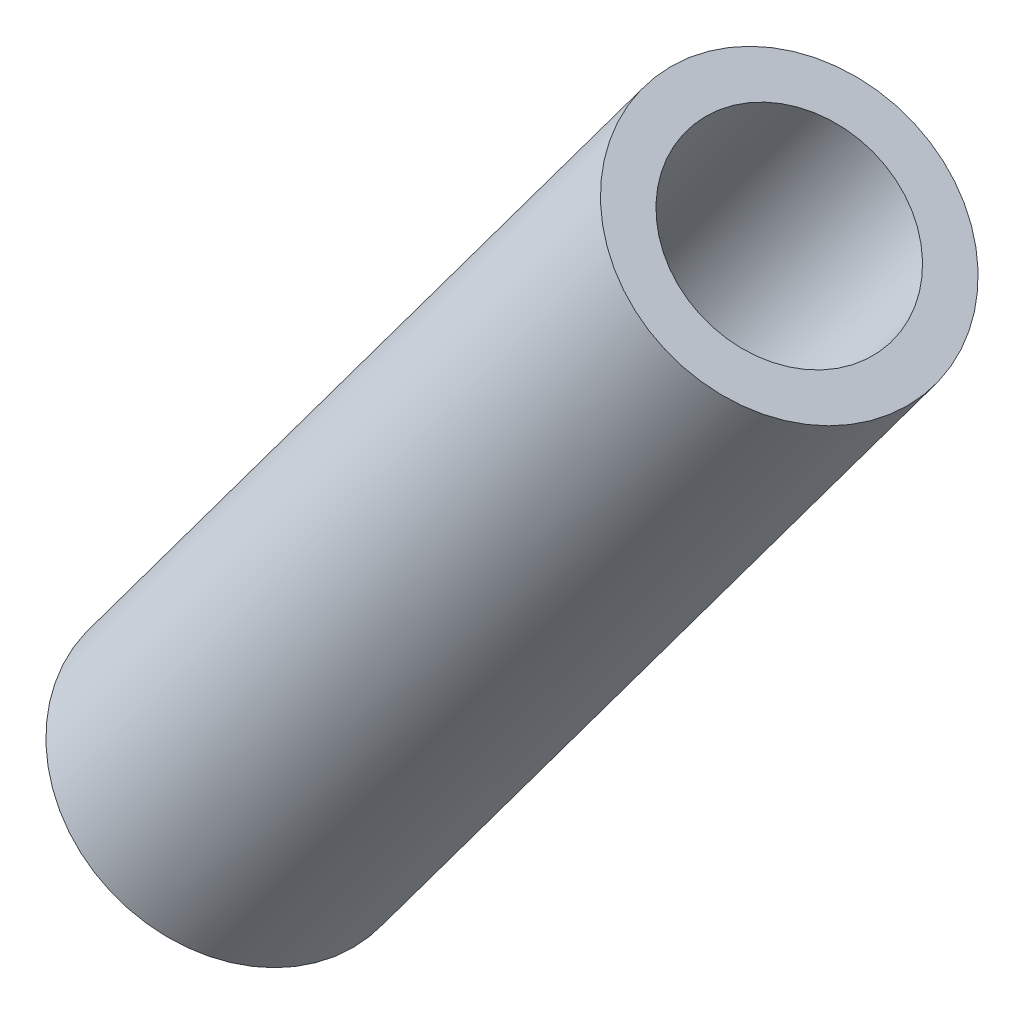
ISO-10303-21;
HEADER;
FILE_DESCRIPTION(('STEP AP214'),'2;1');
FILE_NAME('part.step','',(''),(''),'','','');
FILE_SCHEMA(('AUTOMOTIVE_DESIGN { 1 0 10303 214 1 1 1 1 }'));
ENDSEC;
DATA;
#1=APPLICATION_CONTEXT('core data for automotive mechanical design processes');
#2=APPLICATION_PROTOCOL_DEFINITION('international standard','automotive_design',2000,#1);
#3=PRODUCT_CONTEXT('',#1,'mechanical');
#4=PRODUCT('Part','Part','',(#3));
#5=PRODUCT_RELATED_PRODUCT_CATEGORY('part','',(#4));
#6=PRODUCT_DEFINITION_FORMATION('','',#4);
#7=PRODUCT_DEFINITION_CONTEXT('part definition',#1,'design');
#8=PRODUCT_DEFINITION('design','',#6,#7);
#9=PRODUCT_DEFINITION_SHAPE('','',#8);
#10=(LENGTH_UNIT() NAMED_UNIT(*) SI_UNIT(.MILLI.,.METRE.));
#11=(NAMED_UNIT(*) PLANE_ANGLE_UNIT() SI_UNIT($,.RADIAN.));
#12=(NAMED_UNIT(*) SI_UNIT($,.STERADIAN.) SOLID_ANGLE_UNIT());
#13=UNCERTAINTY_MEASURE_WITH_UNIT(LENGTH_MEASURE(1.E-05),#10,'distance_accuracy_value','');
#14=(GEOMETRIC_REPRESENTATION_CONTEXT(3) GLOBAL_UNCERTAINTY_ASSIGNED_CONTEXT((#13)) GLOBAL_UNIT_ASSIGNED_CONTEXT((#10,
#11,#12)) REPRESENTATION_CONTEXT('',''));
#15=CARTESIAN_POINT('',(0.,0.,0.));
#16=DIRECTION('',(0.,0.,1.));
#17=DIRECTION('',(1.,0.,0.));
#18=AXIS2_PLACEMENT_3D('',#15,#16,#17);
#19=CARTESIAN_POINT('',(-20.51142917502,-27.6159604793703,0.));
#20=DIRECTION('',(0.596262476018024,0.802789548818902,0.));
#21=DIRECTION('',(-0.802789548818902,0.596262476018024,0.));
#22=AXIS2_PLACEMENT_3D('',#19,#20,#21);
#23=PLANE('',#22);
#24=CARTESIAN_POINT('',(-20.51142917502,-27.6159604793703,0.));
#25=DIRECTION('',(0.596262476018024,0.802789548818902,0.));
#26=DIRECTION('',(-0.802789548818902,0.596262476018024,0.));
#27=AXIS2_PLACEMENT_3D('',#24,#25,#26);
#28=CIRCLE('',#27,9.525);
#29=CARTESIAN_POINT('',(-28.1579996275201,-21.9365603952986,0.));
#30=VERTEX_POINT('',#29);
#31=EDGE_CURVE('E65',#30,#30,#28,.F.);
#32=ORIENTED_EDGE('',*,*,#31,.F.);
#33=EDGE_LOOP('',(#32));
#34=FACE_BOUND('',#33,.T.);
#35=CARTESIAN_POINT('',(-20.51142917502,-27.6159604793703,0.));
#36=DIRECTION('',(0.596262476018024,0.802789548818902,0.));
#37=DIRECTION('',(-0.802789548818902,0.596262476018024,0.));
#38=AXIS2_PLACEMENT_3D('',#35,#36,#37);
#39=CIRCLE('',#38,13.49375);
#40=CARTESIAN_POINT('',(-31.3440706493951,-19.5701436936021,0.));
#41=VERTEX_POINT('',#40);
#42=EDGE_CURVE('E57',#41,#41,#39,.T.);
#43=ORIENTED_EDGE('',*,*,#42,.F.);
#44=EDGE_LOOP('',(#43));
#45=FACE_BOUND('',#44,.T.);
#46=ADVANCED_FACE('F51',(#34,#45),#23,.F.);
#47=CARTESIAN_POINT('',(30.2901337817156,40.7817090800002,0.));
#48=DIRECTION('',(0.596262476018024,0.802789548818902,0.));
#49=DIRECTION('',(-0.802789548818902,0.596262476018024,0.));
#50=AXIS2_PLACEMENT_3D('',#47,#48,#49);
#51=PLANE('',#50);
#52=CARTESIAN_POINT('',(30.2901337817156,40.7817090800002,0.));
#53=DIRECTION('',(0.596262476018024,0.802789548818902,0.));
#54=DIRECTION('',(-0.802789548818902,0.596262476018024,0.));
#55=AXIS2_PLACEMENT_3D('',#52,#53,#54);
#56=CIRCLE('',#55,9.525);
#57=CARTESIAN_POINT('',(22.6435633292156,46.4611091640718,0.));
#58=VERTEX_POINT('',#57);
#59=EDGE_CURVE('E61',#58,#58,#56,.F.);
#60=ORIENTED_EDGE('',*,*,#59,.T.);
#61=EDGE_LOOP('',(#60));
#62=FACE_BOUND('',#61,.T.);
#63=CARTESIAN_POINT('',(30.2901337817156,40.7817090800002,0.));
#64=DIRECTION('',(0.596262476018024,0.802789548818902,0.));
#65=DIRECTION('',(-0.802789548818902,0.596262476018024,0.));
#66=AXIS2_PLACEMENT_3D('',#63,#64,#65);
#67=CIRCLE('',#66,13.49375);
#68=CARTESIAN_POINT('',(19.4574923073405,48.8275258657684,0.));
#69=VERTEX_POINT('',#68);
#70=EDGE_CURVE('E11',#69,#69,#67,.T.);
#71=ORIENTED_EDGE('',*,*,#70,.T.);
#72=EDGE_LOOP('',(#71));
#73=FACE_BOUND('',#72,.T.);
#74=ADVANCED_FACE('F76',(#62,#73),#51,.T.);
#75=CARTESIAN_POINT('',(-20.51142917502,-27.6159604793703,0.));
#76=DIRECTION('',(0.596262476018024,0.802789548818902,0.));
#77=DIRECTION('',(-0.802789548818902,0.596262476018024,0.));
#78=AXIS2_PLACEMENT_3D('',#75,#76,#77);
#79=CYLINDRICAL_SURFACE('',#78,13.49375);
#80=ORIENTED_EDGE('',*,*,#70,.F.);
#81=EDGE_LOOP('',(#80));
#82=FACE_BOUND('',#81,.T.);
#83=ORIENTED_EDGE('',*,*,#42,.T.);
#84=EDGE_LOOP('',(#83));
#85=FACE_BOUND('',#84,.T.);
#86=ADVANCED_FACE('F81',(#82,#85),#79,.T.);
#87=CARTESIAN_POINT('',(-23.4927415551101,-31.6299082234648,0.));
#88=DIRECTION('',(0.596262476018023,0.802789548818902,0.));
#89=DIRECTION('',(-0.802789548818902,0.596262476018023,0.));
#90=AXIS2_PLACEMENT_3D('',#87,#88,#89);
#91=CYLINDRICAL_SURFACE('',#90,9.525);
#92=ORIENTED_EDGE('',*,*,#31,.T.);
#93=EDGE_LOOP('',(#92));
#94=FACE_BOUND('',#93,.T.);
#95=ORIENTED_EDGE('',*,*,#59,.F.);
#96=EDGE_LOOP('',(#95));
#97=FACE_BOUND('',#96,.T.);
#98=ADVANCED_FACE('F71',(#94,#97),#91,.F.);
#99=CLOSED_SHELL('',(#46,#74,#86,#98));
#100=MANIFOLD_SOLID_BREP('B2',#99);
#101=ADVANCED_BREP_SHAPE_REPRESENTATION('',(#18,#100),#14);
#102=SHAPE_DEFINITION_REPRESENTATION(#9,#101);
ENDSEC;
END-ISO-10303-21;
